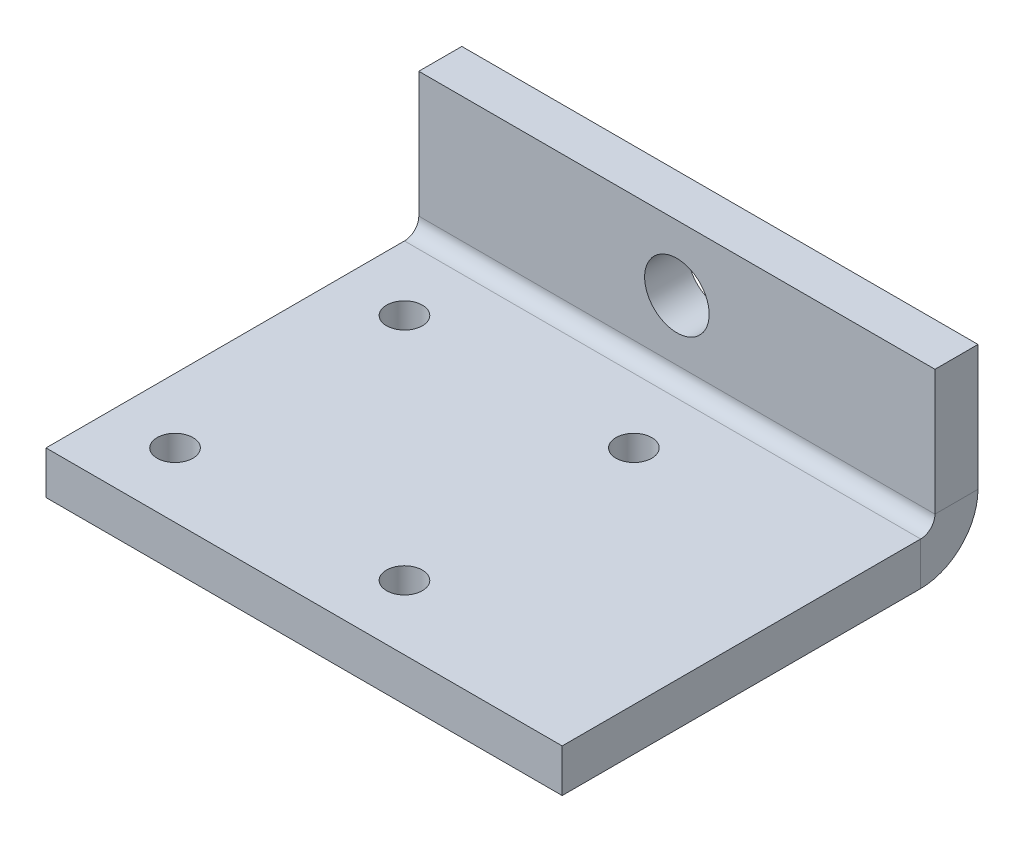
ISO-10303-21;
HEADER;
FILE_DESCRIPTION(('STEP AP214'),'2;1');
FILE_NAME('part.step','',(''),(''),'','','');
FILE_SCHEMA(('AUTOMOTIVE_DESIGN { 1 0 10303 214 1 1 1 1 }'));
ENDSEC;
DATA;
#1=APPLICATION_CONTEXT('core data for automotive mechanical design processes');
#2=APPLICATION_PROTOCOL_DEFINITION('international standard','automotive_design',2000,#1);
#3=PRODUCT_CONTEXT('',#1,'mechanical');
#4=PRODUCT('Part','Part','',(#3));
#5=PRODUCT_RELATED_PRODUCT_CATEGORY('part','',(#4));
#6=PRODUCT_DEFINITION_FORMATION('','',#4);
#7=PRODUCT_DEFINITION_CONTEXT('part definition',#1,'design');
#8=PRODUCT_DEFINITION('design','',#6,#7);
#9=PRODUCT_DEFINITION_SHAPE('','',#8);
#10=(LENGTH_UNIT() NAMED_UNIT(*) SI_UNIT(.MILLI.,.METRE.));
#11=(NAMED_UNIT(*) PLANE_ANGLE_UNIT() SI_UNIT($,.RADIAN.));
#12=(NAMED_UNIT(*) SI_UNIT($,.STERADIAN.) SOLID_ANGLE_UNIT());
#13=UNCERTAINTY_MEASURE_WITH_UNIT(LENGTH_MEASURE(1.E-05),#10,'distance_accuracy_value','');
#14=(GEOMETRIC_REPRESENTATION_CONTEXT(3) GLOBAL_UNCERTAINTY_ASSIGNED_CONTEXT((#13)) GLOBAL_UNIT_ASSIGNED_CONTEXT((#10,
#11,#12)) REPRESENTATION_CONTEXT('',''));
#15=CARTESIAN_POINT('',(0.,0.,0.));
#16=DIRECTION('',(0.,0.,1.));
#17=DIRECTION('',(1.,0.,0.));
#18=AXIS2_PLACEMENT_3D('',#15,#16,#17);
#19=CARTESIAN_POINT('',(36.,0.,3.99999999999999));
#20=DIRECTION('',(1.,0.,0.));
#21=DIRECTION('',(0.,0.,-0.999999999999999));
#22=AXIS2_PLACEMENT_3D('',#19,#20,#21);
#23=PLANE('',#22);
#24=DIRECTION('',(0.,1.,0.));
#25=VECTOR('',#24,1.);
#26=CARTESIAN_POINT('',(36.,0.,3.99999999999999));
#27=LINE('',#26,#25);
#28=CARTESIAN_POINT('',(36.,0.,3.99999999999999));
#29=VERTEX_POINT('',#28);
#30=CARTESIAN_POINT('',(35.9999999999998,3.,4.));
#31=VERTEX_POINT('',#30);
#32=EDGE_CURVE('E11',#29,#31,#27,.T.);
#33=ORIENTED_EDGE('',*,*,#32,.F.);
#34=CARTESIAN_POINT('',(35.9999999999998,4.,4.));
#35=DIRECTION('',(-1.,0.,0.));
#36=DIRECTION('',(0.,0.,0.999999999999999));
#37=AXIS2_PLACEMENT_3D('',#34,#35,#36);
#38=CIRCLE('',#37,4.);
#39=CARTESIAN_POINT('',(35.9999999999999,4.,0.));
#40=VERTEX_POINT('',#39);
#41=EDGE_CURVE('E128',#29,#40,#38,.F.);
#42=ORIENTED_EDGE('',*,*,#41,.T.);
#43=DIRECTION('',(0.,0.,-0.999999999999999));
#44=VECTOR('',#43,1.);
#45=CARTESIAN_POINT('',(35.9999999999998,4.,3.));
#46=LINE('',#45,#44);
#47=CARTESIAN_POINT('',(35.9999999999998,4.,3.));
#48=VERTEX_POINT('',#47);
#49=EDGE_CURVE('E46',#48,#40,#46,.T.);
#50=ORIENTED_EDGE('',*,*,#49,.F.);
#51=CARTESIAN_POINT('',(35.9999999999998,4.,4.));
#52=DIRECTION('',(1.,0.,0.));
#53=DIRECTION('',(0.,0.,-0.999999999999999));
#54=AXIS2_PLACEMENT_3D('',#51,#52,#53);
#55=CIRCLE('',#54,1.);
#56=EDGE_CURVE('E135',#31,#48,#55,.T.);
#57=ORIENTED_EDGE('',*,*,#56,.F.);
#58=EDGE_LOOP('',(#33,#42,#50,#57));
#59=FACE_BOUND('',#58,.T.);
#60=ADVANCED_FACE('F38',(#59),#23,.T.);
#61=CARTESIAN_POINT('',(35.9999999999998,4.,3.));
#62=DIRECTION('',(1.,0.,0.));
#63=DIRECTION('',(0.,0.,-0.999999999999999));
#64=AXIS2_PLACEMENT_3D('',#61,#62,#63);
#65=PLANE('',#64);
#66=DIRECTION('',(0.,0.,-0.999999999999999));
#67=VECTOR('',#66,1.);
#68=CARTESIAN_POINT('',(36.,0.,0.));
#69=LINE('',#68,#67);
#70=CARTESIAN_POINT('',(35.9999999999998,0.,29.));
#71=VERTEX_POINT('',#70);
#72=EDGE_CURVE('E123',#71,#29,#69,.T.);
#73=ORIENTED_EDGE('',*,*,#72,.T.);
#74=ORIENTED_EDGE('',*,*,#32,.T.);
#75=DIRECTION('',(0.,0.,-0.999999999999999));
#76=VECTOR('',#75,1.);
#77=CARTESIAN_POINT('',(35.9999999999999,3.,0.));
#78=LINE('',#77,#76);
#79=CARTESIAN_POINT('',(35.9999999999997,3.,29.));
#80=VERTEX_POINT('',#79);
#81=EDGE_CURVE('E133',#80,#31,#78,.T.);
#82=ORIENTED_EDGE('',*,*,#81,.F.);
#83=DIRECTION('',(0.,1.,0.));
#84=VECTOR('',#83,1.);
#85=CARTESIAN_POINT('',(35.9999999999998,0.,29.));
#86=LINE('',#85,#84);
#87=EDGE_CURVE('E114',#71,#80,#86,.T.);
#88=ORIENTED_EDGE('',*,*,#87,.F.);
#89=EDGE_LOOP('',(#73,#74,#82,#88));
#90=FACE_BOUND('',#89,.T.);
#91=ADVANCED_FACE('F131',(#90),#65,.T.);
#92=CARTESIAN_POINT('',(-1.66533453693773E-13,4.,0.));
#93=DIRECTION('',(-1.,0.,0.));
#94=DIRECTION('',(0.,0.,0.999999999999999));
#95=AXIS2_PLACEMENT_3D('',#92,#93,#94);
#96=PLANE('',#95);
#97=DIRECTION('',(0.,0.,0.999999999999999));
#98=VECTOR('',#97,1.);
#99=CARTESIAN_POINT('',(-1.66533453693773E-13,4.,0.));
#100=LINE('',#99,#98);
#101=CARTESIAN_POINT('',(-1.66533453693773E-13,4.,0.));
#102=VERTEX_POINT('',#101);
#103=CARTESIAN_POINT('',(-1.66533453693773E-13,4.,3.));
#104=VERTEX_POINT('',#103);
#105=EDGE_CURVE('E89',#102,#104,#100,.T.);
#106=ORIENTED_EDGE('',*,*,#105,.F.);
#107=CARTESIAN_POINT('',(-1.66533453693773E-13,4.,4.));
#108=DIRECTION('',(-1.,0.,0.));
#109=DIRECTION('',(0.,0.,0.999999999999999));
#110=AXIS2_PLACEMENT_3D('',#107,#108,#109);
#111=CIRCLE('',#110,4.);
#112=CARTESIAN_POINT('',(0.,0.,3.99999999999999));
#113=VERTEX_POINT('',#112);
#114=EDGE_CURVE('E158',#113,#102,#111,.F.);
#115=ORIENTED_EDGE('',*,*,#114,.F.);
#116=DIRECTION('',(0.,-1.,0.));
#117=VECTOR('',#116,1.);
#118=CARTESIAN_POINT('',(-1.66533453693773E-13,3.,4.));
#119=LINE('',#118,#117);
#120=CARTESIAN_POINT('',(-1.66533453693773E-13,3.,4.));
#121=VERTEX_POINT('',#120);
#122=EDGE_CURVE('E82',#121,#113,#119,.T.);
#123=ORIENTED_EDGE('',*,*,#122,.F.);
#124=CARTESIAN_POINT('',(-1.66533453693773E-13,4.,4.));
#125=DIRECTION('',(1.,0.,0.));
#126=DIRECTION('',(0.,0.,-0.999999999999999));
#127=AXIS2_PLACEMENT_3D('',#124,#125,#126);
#128=CIRCLE('',#127,1.);
#129=EDGE_CURVE('E151',#121,#104,#128,.T.);
#130=ORIENTED_EDGE('',*,*,#129,.T.);
#131=EDGE_LOOP('',(#106,#115,#123,#130));
#132=FACE_BOUND('',#131,.T.);
#133=ADVANCED_FACE('F190',(#132),#96,.T.);
#134=CARTESIAN_POINT('',(-1.66533453693773E-13,3.,4.));
#135=DIRECTION('',(-1.,0.,0.));
#136=DIRECTION('',(0.,0.,0.999999999999999));
#137=AXIS2_PLACEMENT_3D('',#134,#135,#136);
#138=PLANE('',#137);
#139=DIRECTION('',(0.,1.,0.));
#140=VECTOR('',#139,1.);
#141=CARTESIAN_POINT('',(0.,0.,0.));
#142=LINE('',#141,#140);
#143=CARTESIAN_POINT('',(0.,12.75,0.));
#144=VERTEX_POINT('',#143);
#145=EDGE_CURVE('E141',#102,#144,#142,.T.);
#146=ORIENTED_EDGE('',*,*,#145,.F.);
#147=ORIENTED_EDGE('',*,*,#105,.T.);
#148=DIRECTION('',(0.,1.,0.));
#149=VECTOR('',#148,1.);
#150=CARTESIAN_POINT('',(0.,0.,3.));
#151=LINE('',#150,#149);
#152=CARTESIAN_POINT('',(0.,12.75,3.));
#153=VERTEX_POINT('',#152);
#154=EDGE_CURVE('E148',#104,#153,#151,.T.);
#155=ORIENTED_EDGE('',*,*,#154,.T.);
#156=DIRECTION('',(0.,0.,-0.999999999999999));
#157=VECTOR('',#156,1.);
#158=CARTESIAN_POINT('',(0.,12.75,3.));
#159=LINE('',#158,#157);
#160=EDGE_CURVE('E144',#153,#144,#159,.T.);
#161=ORIENTED_EDGE('',*,*,#160,.T.);
#162=EDGE_LOOP('',(#146,#147,#155,#161));
#163=FACE_BOUND('',#162,.T.);
#164=ADVANCED_FACE('F177',(#163),#138,.T.);
#165=CARTESIAN_POINT('',(36.,0.,0.));
#166=DIRECTION('',(0.,0.,0.999999999999999));
#167=DIRECTION('',(1.,0.,0.));
#168=AXIS2_PLACEMENT_3D('',#165,#166,#167);
#169=PLANE('',#168);
#170=CARTESIAN_POINT('',(18.,8.20000000000001,0.));
#171=DIRECTION('',(0.,0.,0.999999999999999));
#172=DIRECTION('',(1.,0.,0.));
#173=AXIS2_PLACEMENT_3D('',#170,#171,#172);
#174=CIRCLE('',#173,2.25);
#175=CARTESIAN_POINT('',(20.25,8.20000000000001,0.));
#176=VERTEX_POINT('',#175);
#177=EDGE_CURVE('E225',#176,#176,#174,.T.);
#178=ORIENTED_EDGE('',*,*,#177,.T.);
#179=EDGE_LOOP('',(#178));
#180=FACE_BOUND('',#179,.T.);
#181=ORIENTED_EDGE('',*,*,#145,.T.);
#182=DIRECTION('',(-1.,0.,0.));
#183=VECTOR('',#182,1.);
#184=CARTESIAN_POINT('',(36.,12.75,0.));
#185=LINE('',#184,#183);
#186=CARTESIAN_POINT('',(36.,12.75,0.));
#187=VERTEX_POINT('',#186);
#188=EDGE_CURVE('E172',#187,#144,#185,.T.);
#189=ORIENTED_EDGE('',*,*,#188,.F.);
#190=DIRECTION('',(0.,1.,0.));
#191=VECTOR('',#190,1.);
#192=CARTESIAN_POINT('',(36.,0.,0.));
#193=LINE('',#192,#191);
#194=EDGE_CURVE('E95',#40,#187,#193,.T.);
#195=ORIENTED_EDGE('',*,*,#194,.F.);
#196=DIRECTION('',(-1.,0.,0.));
#197=VECTOR('',#196,1.);
#198=CARTESIAN_POINT('',(35.9999999999999,4.,0.));
#199=LINE('',#198,#197);
#200=EDGE_CURVE('E140',#40,#102,#199,.T.);
#201=ORIENTED_EDGE('',*,*,#200,.T.);
#202=EDGE_LOOP('',(#181,#189,#195,#201));
#203=FACE_BOUND('',#202,.T.);
#204=ADVANCED_FACE('F242',(#180,#203),#169,.F.);
#205=CARTESIAN_POINT('',(36.,12.75,3.));
#206=DIRECTION('',(0.,1.,0.));
#207=DIRECTION('',(0.,0.,0.999999999999999));
#208=AXIS2_PLACEMENT_3D('',#205,#206,#207);
#209=PLANE('',#208);
#210=ORIENTED_EDGE('',*,*,#160,.F.);
#211=DIRECTION('',(-1.,0.,0.));
#212=VECTOR('',#211,1.);
#213=CARTESIAN_POINT('',(36.,12.75,3.));
#214=LINE('',#213,#212);
#215=CARTESIAN_POINT('',(36.,12.75,3.));
#216=VERTEX_POINT('',#215);
#217=EDGE_CURVE('E170',#216,#153,#214,.T.);
#218=ORIENTED_EDGE('',*,*,#217,.F.);
#219=DIRECTION('',(0.,0.,-0.999999999999999));
#220=VECTOR('',#219,1.);
#221=CARTESIAN_POINT('',(36.,12.75,3.));
#222=LINE('',#221,#220);
#223=EDGE_CURVE('E196',#216,#187,#222,.T.);
#224=ORIENTED_EDGE('',*,*,#223,.T.);
#225=ORIENTED_EDGE('',*,*,#188,.T.);
#226=EDGE_LOOP('',(#210,#218,#224,#225));
#227=FACE_BOUND('',#226,.T.);
#228=ADVANCED_FACE('F235',(#227),#209,.T.);
#229=CARTESIAN_POINT('',(36.,0.,3.));
#230=DIRECTION('',(0.,0.,0.999999999999999));
#231=DIRECTION('',(1.,0.,0.));
#232=AXIS2_PLACEMENT_3D('',#229,#230,#231);
#233=PLANE('',#232);
#234=CARTESIAN_POINT('',(18.,8.20000000000001,3.));
#235=DIRECTION('',(0.,0.,0.999999999999999));
#236=DIRECTION('',(1.,0.,0.));
#237=AXIS2_PLACEMENT_3D('',#234,#235,#236);
#238=CIRCLE('',#237,2.25);
#239=CARTESIAN_POINT('',(20.25,8.20000000000001,3.));
#240=VERTEX_POINT('',#239);
#241=EDGE_CURVE('E228',#240,#240,#238,.T.);
#242=ORIENTED_EDGE('',*,*,#241,.F.);
#243=EDGE_LOOP('',(#242));
#244=FACE_BOUND('',#243,.T.);
#245=ORIENTED_EDGE('',*,*,#154,.F.);
#246=DIRECTION('',(-1.,0.,0.));
#247=VECTOR('',#246,1.);
#248=CARTESIAN_POINT('',(35.9999999999998,4.,3.));
#249=LINE('',#248,#247);
#250=EDGE_CURVE('E167',#48,#104,#249,.T.);
#251=ORIENTED_EDGE('',*,*,#250,.F.);
#252=DIRECTION('',(0.,1.,0.));
#253=VECTOR('',#252,1.);
#254=CARTESIAN_POINT('',(36.,0.,3.));
#255=LINE('',#254,#253);
#256=EDGE_CURVE('E195',#48,#216,#255,.T.);
#257=ORIENTED_EDGE('',*,*,#256,.T.);
#258=ORIENTED_EDGE('',*,*,#217,.T.);
#259=EDGE_LOOP('',(#245,#251,#257,#258));
#260=FACE_BOUND('',#259,.T.);
#261=ADVANCED_FACE('F188',(#244,#260),#233,.T.);
#262=CARTESIAN_POINT('',(35.9999999999998,4.,4.));
#263=DIRECTION('',(-1.,0.,0.));
#264=DIRECTION('',(0.,0.,0.999999999999999));
#265=AXIS2_PLACEMENT_3D('',#262,#263,#264);
#266=CYLINDRICAL_SURFACE('',#265,1.);
#267=ORIENTED_EDGE('',*,*,#129,.F.);
#268=DIRECTION('',(-1.,0.,0.));
#269=VECTOR('',#268,1.);
#270=CARTESIAN_POINT('',(35.9999999999998,3.,4.));
#271=LINE('',#270,#269);
#272=EDGE_CURVE('E164',#31,#121,#271,.T.);
#273=ORIENTED_EDGE('',*,*,#272,.F.);
#274=ORIENTED_EDGE('',*,*,#56,.T.);
#275=ORIENTED_EDGE('',*,*,#250,.T.);
#276=EDGE_LOOP('',(#267,#273,#274,#275));
#277=FACE_BOUND('',#276,.T.);
#278=ADVANCED_FACE('F183',(#277),#266,.F.);
#279=CARTESIAN_POINT('',(35.9999999999999,3.,0.));
#280=DIRECTION('',(0.,1.,0.));
#281=DIRECTION('',(0.,0.,0.999999999999999));
#282=AXIS2_PLACEMENT_3D('',#279,#280,#281);
#283=PLANE('',#282);
#284=CARTESIAN_POINT('',(4.49999999999984,3.,24.5));
#285=DIRECTION('',(0.,1.,0.));
#286=DIRECTION('',(0.,0.,0.999999999999999));
#287=AXIS2_PLACEMENT_3D('',#284,#285,#286);
#288=CIRCLE('',#287,1.24999999999999);
#289=CARTESIAN_POINT('',(4.49999999999984,3.,25.75));
#290=VERTEX_POINT('',#289);
#291=EDGE_CURVE('E222',#290,#290,#288,.T.);
#292=ORIENTED_EDGE('',*,*,#291,.F.);
#293=EDGE_LOOP('',(#292));
#294=FACE_BOUND('',#293,.T.);
#295=CARTESIAN_POINT('',(4.49999999999984,3.,8.49999999999999));
#296=DIRECTION('',(0.,1.,0.));
#297=DIRECTION('',(0.,0.,0.999999999999999));
#298=AXIS2_PLACEMENT_3D('',#295,#296,#297);
#299=CIRCLE('',#298,1.24999999999999);
#300=CARTESIAN_POINT('',(4.49999999999984,3.,9.74999999999997));
#301=VERTEX_POINT('',#300);
#302=EDGE_CURVE('E216',#301,#301,#299,.T.);
#303=ORIENTED_EDGE('',*,*,#302,.F.);
#304=EDGE_LOOP('',(#303));
#305=FACE_BOUND('',#304,.T.);
#306=CARTESIAN_POINT('',(20.4999999999998,3.,8.49999999999999));
#307=DIRECTION('',(0.,1.,0.));
#308=DIRECTION('',(0.,0.,0.999999999999999));
#309=AXIS2_PLACEMENT_3D('',#306,#307,#308);
#310=CIRCLE('',#309,1.24999999999999);
#311=CARTESIAN_POINT('',(20.4999999999998,3.,9.74999999999997));
#312=VERTEX_POINT('',#311);
#313=EDGE_CURVE('E210',#312,#312,#310,.T.);
#314=ORIENTED_EDGE('',*,*,#313,.F.);
#315=EDGE_LOOP('',(#314));
#316=FACE_BOUND('',#315,.T.);
#317=CARTESIAN_POINT('',(20.4999999999998,3.,24.5));
#318=DIRECTION('',(0.,1.,0.));
#319=DIRECTION('',(0.,0.,0.999999999999999));
#320=AXIS2_PLACEMENT_3D('',#317,#318,#319);
#321=CIRCLE('',#320,1.24999999999999);
#322=CARTESIAN_POINT('',(20.4999999999998,3.,25.75));
#323=VERTEX_POINT('',#322);
#324=EDGE_CURVE('E204',#323,#323,#321,.T.);
#325=ORIENTED_EDGE('',*,*,#324,.F.);
#326=EDGE_LOOP('',(#325));
#327=FACE_BOUND('',#326,.T.);
#328=DIRECTION('',(0.,0.,-0.999999999999999));
#329=VECTOR('',#328,1.);
#330=CARTESIAN_POINT('',(-1.66533453693773E-13,3.,0.));
#331=LINE('',#330,#329);
#332=CARTESIAN_POINT('',(-3.33066907387547E-13,3.,29.));
#333=VERTEX_POINT('',#332);
#334=EDGE_CURVE('E153',#333,#121,#331,.T.);
#335=ORIENTED_EDGE('',*,*,#334,.F.);
#336=DIRECTION('',(-1.,0.,0.));
#337=VECTOR('',#336,1.);
#338=CARTESIAN_POINT('',(35.9999999999997,3.,29.));
#339=LINE('',#338,#337);
#340=EDGE_CURVE('E118',#80,#333,#339,.T.);
#341=ORIENTED_EDGE('',*,*,#340,.F.);
#342=ORIENTED_EDGE('',*,*,#81,.T.);
#343=ORIENTED_EDGE('',*,*,#272,.T.);
#344=EDGE_LOOP('',(#335,#341,#342,#343));
#345=FACE_BOUND('',#344,.T.);
#346=ADVANCED_FACE('F193',(#294,#305,#316,#327,#345),#283,.T.);
#347=CARTESIAN_POINT('',(35.9999999999998,0.,29.));
#348=DIRECTION('',(0.,0.,0.999999999999999));
#349=DIRECTION('',(1.,0.,0.));
#350=AXIS2_PLACEMENT_3D('',#347,#348,#349);
#351=PLANE('',#350);
#352=DIRECTION('',(0.,1.,0.));
#353=VECTOR('',#352,1.);
#354=CARTESIAN_POINT('',(-1.66533453693773E-13,0.,29.));
#355=LINE('',#354,#353);
#356=CARTESIAN_POINT('',(-1.66533453693773E-13,0.,29.));
#357=VERTEX_POINT('',#356);
#358=EDGE_CURVE('E116',#357,#333,#355,.T.);
#359=ORIENTED_EDGE('',*,*,#358,.F.);
#360=DIRECTION('',(-1.,0.,0.));
#361=VECTOR('',#360,1.);
#362=CARTESIAN_POINT('',(35.9999999999998,0.,29.));
#363=LINE('',#362,#361);
#364=EDGE_CURVE('E110',#71,#357,#363,.T.);
#365=ORIENTED_EDGE('',*,*,#364,.F.);
#366=ORIENTED_EDGE('',*,*,#87,.T.);
#367=ORIENTED_EDGE('',*,*,#340,.T.);
#368=EDGE_LOOP('',(#359,#365,#366,#367));
#369=FACE_BOUND('',#368,.T.);
#370=ADVANCED_FACE('F112',(#369),#351,.T.);
#371=CARTESIAN_POINT('',(36.,0.,0.));
#372=DIRECTION('',(0.,1.,0.));
#373=DIRECTION('',(0.,0.,0.999999999999999));
#374=AXIS2_PLACEMENT_3D('',#371,#372,#373);
#375=PLANE('',#374);
#376=CARTESIAN_POINT('',(4.49999999999984,0.,24.5));
#377=DIRECTION('',(0.,1.,0.));
#378=DIRECTION('',(0.,0.,0.999999999999999));
#379=AXIS2_PLACEMENT_3D('',#376,#377,#378);
#380=CIRCLE('',#379,1.24999999999999);
#381=CARTESIAN_POINT('',(4.49999999999984,0.,25.75));
#382=VERTEX_POINT('',#381);
#383=EDGE_CURVE('E219',#382,#382,#380,.T.);
#384=ORIENTED_EDGE('',*,*,#383,.T.);
#385=EDGE_LOOP('',(#384));
#386=FACE_BOUND('',#385,.T.);
#387=CARTESIAN_POINT('',(4.49999999999984,0.,8.49999999999999));
#388=DIRECTION('',(0.,1.,0.));
#389=DIRECTION('',(0.,0.,0.999999999999999));
#390=AXIS2_PLACEMENT_3D('',#387,#388,#389);
#391=CIRCLE('',#390,1.24999999999999);
#392=CARTESIAN_POINT('',(4.49999999999984,0.,9.74999999999997));
#393=VERTEX_POINT('',#392);
#394=EDGE_CURVE('E213',#393,#393,#391,.T.);
#395=ORIENTED_EDGE('',*,*,#394,.T.);
#396=EDGE_LOOP('',(#395));
#397=FACE_BOUND('',#396,.T.);
#398=CARTESIAN_POINT('',(20.4999999999999,0.,8.49999999999999));
#399=DIRECTION('',(0.,1.,0.));
#400=DIRECTION('',(0.,0.,0.999999999999999));
#401=AXIS2_PLACEMENT_3D('',#398,#399,#400);
#402=CIRCLE('',#401,1.24999999999999);
#403=CARTESIAN_POINT('',(20.4999999999999,0.,9.74999999999997));
#404=VERTEX_POINT('',#403);
#405=EDGE_CURVE('E207',#404,#404,#402,.T.);
#406=ORIENTED_EDGE('',*,*,#405,.T.);
#407=EDGE_LOOP('',(#406));
#408=FACE_BOUND('',#407,.T.);
#409=CARTESIAN_POINT('',(20.4999999999999,0.,24.5));
#410=DIRECTION('',(0.,1.,0.));
#411=DIRECTION('',(0.,0.,0.999999999999999));
#412=AXIS2_PLACEMENT_3D('',#409,#410,#411);
#413=CIRCLE('',#412,1.24999999999999);
#414=CARTESIAN_POINT('',(20.4999999999999,0.,25.75));
#415=VERTEX_POINT('',#414);
#416=EDGE_CURVE('E145',#415,#415,#413,.T.);
#417=ORIENTED_EDGE('',*,*,#416,.T.);
#418=EDGE_LOOP('',(#417));
#419=FACE_BOUND('',#418,.T.);
#420=DIRECTION('',(0.,0.,-0.999999999999999));
#421=VECTOR('',#420,1.);
#422=CARTESIAN_POINT('',(0.,0.,0.));
#423=LINE('',#422,#421);
#424=EDGE_CURVE('E156',#357,#113,#423,.T.);
#425=ORIENTED_EDGE('',*,*,#424,.T.);
#426=DIRECTION('',(-1.,0.,0.));
#427=VECTOR('',#426,1.);
#428=CARTESIAN_POINT('',(36.,0.,3.99999999999999));
#429=LINE('',#428,#427);
#430=EDGE_CURVE('E119',#29,#113,#429,.T.);
#431=ORIENTED_EDGE('',*,*,#430,.F.);
#432=ORIENTED_EDGE('',*,*,#72,.F.);
#433=ORIENTED_EDGE('',*,*,#364,.T.);
#434=EDGE_LOOP('',(#425,#431,#432,#433));
#435=FACE_BOUND('',#434,.T.);
#436=ADVANCED_FACE('F124',(#386,#397,#408,#419,#435),#375,.F.);
#437=CARTESIAN_POINT('',(35.9999999999998,4.,4.));
#438=DIRECTION('',(-1.,0.,0.));
#439=DIRECTION('',(0.,0.,0.999999999999999));
#440=AXIS2_PLACEMENT_3D('',#437,#438,#439);
#441=CYLINDRICAL_SURFACE('',#440,4.);
#442=ORIENTED_EDGE('',*,*,#114,.T.);
#443=ORIENTED_EDGE('',*,*,#200,.F.);
#444=ORIENTED_EDGE('',*,*,#41,.F.);
#445=ORIENTED_EDGE('',*,*,#430,.T.);
#446=EDGE_LOOP('',(#442,#443,#444,#445));
#447=FACE_BOUND('',#446,.T.);
#448=ADVANCED_FACE('F266',(#447),#441,.T.);
#449=CARTESIAN_POINT('',(35.9999999999998,4.,4.));
#450=DIRECTION('',(1.,0.,0.));
#451=DIRECTION('',(0.,0.,-0.999999999999999));
#452=AXIS2_PLACEMENT_3D('',#449,#450,#451);
#453=PLANE('',#452);
#454=ORIENTED_EDGE('',*,*,#194,.T.);
#455=ORIENTED_EDGE('',*,*,#223,.F.);
#456=ORIENTED_EDGE('',*,*,#256,.F.);
#457=ORIENTED_EDGE('',*,*,#49,.T.);
#458=EDGE_LOOP('',(#454,#455,#456,#457));
#459=FACE_BOUND('',#458,.T.);
#460=ADVANCED_FACE('F263',(#459),#453,.T.);
#461=CARTESIAN_POINT('',(-1.66533453693773E-13,4.,4.));
#462=DIRECTION('',(1.,0.,0.));
#463=DIRECTION('',(0.,0.,-0.999999999999999));
#464=AXIS2_PLACEMENT_3D('',#461,#462,#463);
#465=PLANE('',#464);
#466=ORIENTED_EDGE('',*,*,#334,.T.);
#467=ORIENTED_EDGE('',*,*,#122,.T.);
#468=ORIENTED_EDGE('',*,*,#424,.F.);
#469=ORIENTED_EDGE('',*,*,#358,.T.);
#470=EDGE_LOOP('',(#466,#467,#468,#469));
#471=FACE_BOUND('',#470,.T.);
#472=ADVANCED_FACE('F265',(#471),#465,.F.);
#473=CARTESIAN_POINT('',(20.4999999999998,3.,24.5));
#474=DIRECTION('',(0.,1.,0.));
#475=DIRECTION('',(0.,0.,0.999999999999999));
#476=AXIS2_PLACEMENT_3D('',#473,#474,#475);
#477=CYLINDRICAL_SURFACE('',#476,1.24999999999999);
#478=ORIENTED_EDGE('',*,*,#416,.F.);
#479=EDGE_LOOP('',(#478));
#480=FACE_BOUND('',#479,.T.);
#481=ORIENTED_EDGE('',*,*,#324,.T.);
#482=EDGE_LOOP('',(#481));
#483=FACE_BOUND('',#482,.T.);
#484=ADVANCED_FACE('F272',(#480,#483),#477,.F.);
#485=CARTESIAN_POINT('',(20.4999999999998,3.,8.49999999999999));
#486=DIRECTION('',(0.,1.,0.));
#487=DIRECTION('',(0.,0.,0.999999999999999));
#488=AXIS2_PLACEMENT_3D('',#485,#486,#487);
#489=CYLINDRICAL_SURFACE('',#488,1.24999999999999);
#490=ORIENTED_EDGE('',*,*,#405,.F.);
#491=EDGE_LOOP('',(#490));
#492=FACE_BOUND('',#491,.T.);
#493=ORIENTED_EDGE('',*,*,#313,.T.);
#494=EDGE_LOOP('',(#493));
#495=FACE_BOUND('',#494,.T.);
#496=ADVANCED_FACE('F297',(#492,#495),#489,.F.);
#497=CARTESIAN_POINT('',(4.49999999999984,3.,8.49999999999999));
#498=DIRECTION('',(0.,1.,0.));
#499=DIRECTION('',(0.,0.,0.999999999999999));
#500=AXIS2_PLACEMENT_3D('',#497,#498,#499);
#501=CYLINDRICAL_SURFACE('',#500,1.24999999999999);
#502=ORIENTED_EDGE('',*,*,#394,.F.);
#503=EDGE_LOOP('',(#502));
#504=FACE_BOUND('',#503,.T.);
#505=ORIENTED_EDGE('',*,*,#302,.T.);
#506=EDGE_LOOP('',(#505));
#507=FACE_BOUND('',#506,.T.);
#508=ADVANCED_FACE('F302',(#504,#507),#501,.F.);
#509=CARTESIAN_POINT('',(4.49999999999984,3.,24.5));
#510=DIRECTION('',(0.,1.,0.));
#511=DIRECTION('',(0.,0.,0.999999999999999));
#512=AXIS2_PLACEMENT_3D('',#509,#510,#511);
#513=CYLINDRICAL_SURFACE('',#512,1.24999999999999);
#514=ORIENTED_EDGE('',*,*,#383,.F.);
#515=EDGE_LOOP('',(#514));
#516=FACE_BOUND('',#515,.T.);
#517=ORIENTED_EDGE('',*,*,#291,.T.);
#518=EDGE_LOOP('',(#517));
#519=FACE_BOUND('',#518,.T.);
#520=ADVANCED_FACE('F309',(#516,#519),#513,.F.);
#521=CARTESIAN_POINT('',(18.,8.20000000000001,3.));
#522=DIRECTION('',(0.,0.,0.999999999999999));
#523=DIRECTION('',(1.,0.,0.));
#524=AXIS2_PLACEMENT_3D('',#521,#522,#523);
#525=CYLINDRICAL_SURFACE('',#524,2.25);
#526=CARTESIAN_POINT('',(20.25,8.20000000000001,0.));
#527=CARTESIAN_POINT('',(20.25,8.20000000000001,0.0312499999999994));
#528=CARTESIAN_POINT('',(20.25,8.20000000000001,0.0624999999999993));
#529=CARTESIAN_POINT('',(20.25,8.20000000000001,0.124999999999999));
#530=CARTESIAN_POINT('',(20.25,8.20000000000001,0.156249999999999));
#531=CARTESIAN_POINT('',(20.25,8.20000000000001,0.218749999999999));
#532=CARTESIAN_POINT('',(20.25,8.20000000000001,0.249999999999999));
#533=CARTESIAN_POINT('',(20.25,8.20000000000001,0.312499999999999));
#534=CARTESIAN_POINT('',(20.25,8.20000000000001,0.343749999999999));
#535=CARTESIAN_POINT('',(20.25,8.20000000000001,0.40625));
#536=CARTESIAN_POINT('',(20.25,8.20000000000001,0.4375));
#537=CARTESIAN_POINT('',(20.25,8.20000000000001,0.5));
#538=CARTESIAN_POINT('',(20.25,8.20000000000001,0.53125));
#539=CARTESIAN_POINT('',(20.25,8.20000000000001,0.59375));
#540=CARTESIAN_POINT('',(20.25,8.20000000000001,0.624999999999999));
#541=CARTESIAN_POINT('',(20.25,8.20000000000001,0.687499999999999));
#542=CARTESIAN_POINT('',(20.25,8.20000000000001,0.718749999999999));
#543=CARTESIAN_POINT('',(20.25,8.20000000000001,0.781249999999999));
#544=CARTESIAN_POINT('',(20.25,8.20000000000001,0.812499999999999));
#545=CARTESIAN_POINT('',(20.25,8.20000000000001,0.874999999999999));
#546=CARTESIAN_POINT('',(20.25,8.20000000000001,0.906249999999999));
#547=CARTESIAN_POINT('',(20.25,8.20000000000001,0.968749999999999));
#548=CARTESIAN_POINT('',(20.25,8.20000000000001,0.999999999999999));
#549=CARTESIAN_POINT('',(20.25,8.20000000000001,1.0625));
#550=CARTESIAN_POINT('',(20.25,8.20000000000001,1.09375));
#551=CARTESIAN_POINT('',(20.25,8.20000000000001,1.15625));
#552=CARTESIAN_POINT('',(20.25,8.20000000000001,1.1875));
#553=CARTESIAN_POINT('',(20.25,8.20000000000001,1.25));
#554=CARTESIAN_POINT('',(20.25,8.20000000000001,1.28125));
#555=CARTESIAN_POINT('',(20.25,8.20000000000001,1.34375));
#556=CARTESIAN_POINT('',(20.25,8.20000000000001,1.375));
#557=CARTESIAN_POINT('',(20.25,8.20000000000001,1.4375));
#558=CARTESIAN_POINT('',(20.25,8.20000000000001,1.46875));
#559=CARTESIAN_POINT('',(20.25,8.20000000000001,1.53125));
#560=CARTESIAN_POINT('',(20.25,8.20000000000001,1.5625));
#561=CARTESIAN_POINT('',(20.25,8.20000000000001,1.625));
#562=CARTESIAN_POINT('',(20.25,8.20000000000001,1.65625));
#563=CARTESIAN_POINT('',(20.25,8.20000000000001,1.71875));
#564=CARTESIAN_POINT('',(20.25,8.20000000000001,1.75));
#565=CARTESIAN_POINT('',(20.25,8.20000000000001,1.8125));
#566=CARTESIAN_POINT('',(20.25,8.20000000000001,1.84375));
#567=CARTESIAN_POINT('',(20.25,8.20000000000001,1.90625));
#568=CARTESIAN_POINT('',(20.25,8.20000000000001,1.9375));
#569=CARTESIAN_POINT('',(20.25,8.20000000000001,2.));
#570=CARTESIAN_POINT('',(20.25,8.20000000000001,2.03125));
#571=CARTESIAN_POINT('',(20.25,8.20000000000001,2.09375));
#572=CARTESIAN_POINT('',(20.25,8.20000000000001,2.125));
#573=CARTESIAN_POINT('',(20.25,8.20000000000001,2.1875));
#574=CARTESIAN_POINT('',(20.25,8.20000000000001,2.21875));
#575=CARTESIAN_POINT('',(20.25,8.20000000000001,2.28125));
#576=CARTESIAN_POINT('',(20.25,8.20000000000001,2.3125));
#577=CARTESIAN_POINT('',(20.25,8.20000000000001,2.375));
#578=CARTESIAN_POINT('',(20.25,8.20000000000001,2.40625));
#579=CARTESIAN_POINT('',(20.25,8.20000000000001,2.46875));
#580=CARTESIAN_POINT('',(20.25,8.20000000000001,2.5));
#581=CARTESIAN_POINT('',(20.25,8.20000000000001,2.5625));
#582=CARTESIAN_POINT('',(20.25,8.20000000000001,2.59375));
#583=CARTESIAN_POINT('',(20.25,8.20000000000001,2.65625));
#584=CARTESIAN_POINT('',(20.25,8.20000000000001,2.6875));
#585=CARTESIAN_POINT('',(20.25,8.20000000000001,2.75));
#586=CARTESIAN_POINT('',(20.25,8.20000000000001,2.78125));
#587=CARTESIAN_POINT('',(20.25,8.20000000000001,2.84375));
#588=CARTESIAN_POINT('',(20.25,8.20000000000001,2.875));
#589=CARTESIAN_POINT('',(20.25,8.20000000000001,2.9375));
#590=CARTESIAN_POINT('',(20.25,8.20000000000001,2.96875));
#591=CARTESIAN_POINT('',(20.25,8.20000000000001,3.));
#592=B_SPLINE_CURVE_WITH_KNOTS('',3,(#526,#527,#528,#529,#530,#531,#532,#533,#534,#535,#536,
#537,#538,#539,#540,#541,#542,#543,#544,#545,#546,#547,#548,#549,#550,#551,#552,#553,#554,#555,
#556,#557,#558,#559,#560,#561,#562,#563,#564,#565,#566,#567,#568,#569,#570,#571,#572,#573,#574,
#575,#576,#577,#578,#579,#580,#581,#582,#583,#584,#585,#586,#587,#588,#589,#590,#591),
.UNSPECIFIED.,.F.,.F.,(4,2,2,2,2,2,2,2,2,2,2,2,2,2,2,2,2,2,2,2,2,2,2,2,2,2,2,2,2,2,2,2,4),(0.,
0.0937499999999997,0.1875,0.28125,0.375,0.46875,0.5625,0.65625,0.749999999999999,
0.843749999999999,0.9375,1.03125,1.125,1.21875,1.3125,1.40625,1.5,1.59375,1.6875,1.78125,1.875,
1.96875,2.0625,2.15625,2.25,2.34375,2.4375,2.53125,2.625,2.71875,2.8125,2.90625,3.),.UNSPECIFIED.);
#593=EDGE_CURVE('BSEAM232',#176,#240,#592,.T.);
#594=ORIENTED_EDGE('',*,*,#177,.F.);
#595=ORIENTED_EDGE('',*,*,#241,.T.);
#596=ORIENTED_EDGE('',*,*,#593,.T.);
#597=ORIENTED_EDGE('',*,*,#593,.F.);
#598=EDGE_LOOP('',(#594,#596,#595,#597));
#599=FACE_BOUND('',#598,.T.);
#600=ADVANCED_FACE('F232',(#599),#525,.F.);
#601=CLOSED_SHELL('',(#60,#91,#133,#164,#204,#228,#261,#278,#346,#370,#436,#448,#460,#472,#484,
#496,#508,#520,#600));
#602=MANIFOLD_SOLID_BREP('B2',#601);
#603=ADVANCED_BREP_SHAPE_REPRESENTATION('',(#18,#602),#14);
#604=SHAPE_DEFINITION_REPRESENTATION(#9,#603);
ENDSEC;
END-ISO-10303-21;
